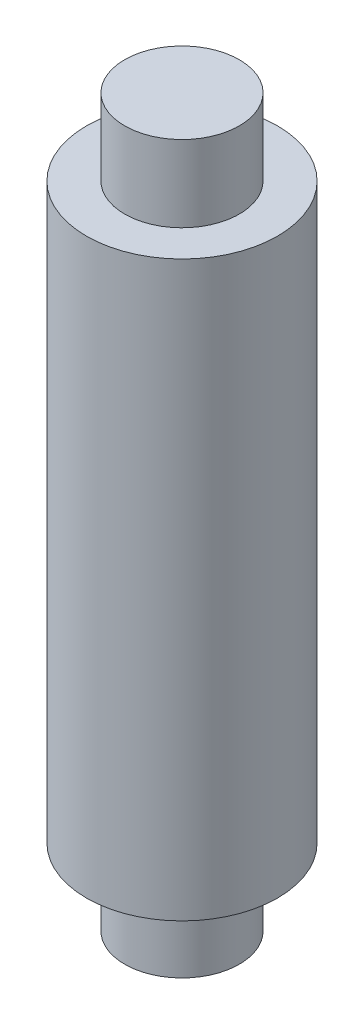
ISO-10303-21;
HEADER;
FILE_DESCRIPTION(('STEP AP214'),'2;1');
FILE_NAME('part.step','',(''),(''),'','','');
FILE_SCHEMA(('AUTOMOTIVE_DESIGN { 1 0 10303 214 1 1 1 1 }'));
ENDSEC;
DATA;
#1=APPLICATION_CONTEXT('core data for automotive mechanical design processes');
#2=APPLICATION_PROTOCOL_DEFINITION('international standard','automotive_design',2000,#1);
#3=PRODUCT_CONTEXT('',#1,'mechanical');
#4=PRODUCT('Part','Part','',(#3));
#5=PRODUCT_RELATED_PRODUCT_CATEGORY('part','',(#4));
#6=PRODUCT_DEFINITION_FORMATION('','',#4);
#7=PRODUCT_DEFINITION_CONTEXT('part definition',#1,'design');
#8=PRODUCT_DEFINITION('design','',#6,#7);
#9=PRODUCT_DEFINITION_SHAPE('','',#8);
#10=(LENGTH_UNIT() NAMED_UNIT(*) SI_UNIT(.MILLI.,.METRE.));
#11=(NAMED_UNIT(*) PLANE_ANGLE_UNIT() SI_UNIT($,.RADIAN.));
#12=(NAMED_UNIT(*) SI_UNIT($,.STERADIAN.) SOLID_ANGLE_UNIT());
#13=UNCERTAINTY_MEASURE_WITH_UNIT(LENGTH_MEASURE(1.E-05),#10,'distance_accuracy_value','');
#14=(GEOMETRIC_REPRESENTATION_CONTEXT(3) GLOBAL_UNCERTAINTY_ASSIGNED_CONTEXT((#13)) GLOBAL_UNIT_ASSIGNED_CONTEXT((#10,
#11,#12)) REPRESENTATION_CONTEXT('',''));
#15=CARTESIAN_POINT('',(0.,0.,0.));
#16=DIRECTION('',(0.,0.,1.));
#17=DIRECTION('',(1.,0.,0.));
#18=AXIS2_PLACEMENT_3D('',#15,#16,#17);
#19=CARTESIAN_POINT('',(-1.5,-11.6600942769009,0.));
#20=DIRECTION('',(0.,1.,0.));
#21=DIRECTION('',(-1.,0.,0.));
#22=AXIS2_PLACEMENT_3D('',#19,#20,#21);
#23=PLANE('',#22);
#24=CARTESIAN_POINT('',(0.,-11.6600942769009,0.));
#25=DIRECTION('',(0.,1.,0.));
#26=DIRECTION('',(-1.,0.,0.));
#27=AXIS2_PLACEMENT_3D('',#24,#25,#26);
#28=CIRCLE('',#27,1.5);
#29=CARTESIAN_POINT('',(-1.5,-11.6600942769009,0.));
#30=VERTEX_POINT('',#29);
#31=EDGE_CURVE('E58',#30,#30,#28,.T.);
#32=ORIENTED_EDGE('',*,*,#31,.T.);
#33=EDGE_LOOP('',(#32));
#34=FACE_BOUND('',#33,.T.);
#35=ADVANCED_FACE('F36',(#34),#23,.T.);
#36=CARTESIAN_POINT('',(0.,-30.6600942769009,0.));
#37=DIRECTION('',(0.,-1.,0.));
#38=DIRECTION('',(1.,0.,0.));
#39=AXIS2_PLACEMENT_3D('',#36,#37,#38);
#40=PLANE('',#39);
#41=CARTESIAN_POINT('',(0.,-30.6600942769009,0.));
#42=DIRECTION('',(0.,1.,0.));
#43=DIRECTION('',(-1.,0.,0.));
#44=AXIS2_PLACEMENT_3D('',#41,#42,#43);
#45=CIRCLE('',#44,1.5);
#46=CARTESIAN_POINT('',(-1.5,-30.6600942769009,0.));
#47=VERTEX_POINT('',#46);
#48=EDGE_CURVE('E10',#47,#47,#45,.T.);
#49=ORIENTED_EDGE('',*,*,#48,.F.);
#50=EDGE_LOOP('',(#49));
#51=FACE_BOUND('',#50,.T.);
#52=ADVANCED_FACE('F75',(#51),#40,.T.);
#53=CARTESIAN_POINT('',(0.,-11.6600942769009,0.));
#54=DIRECTION('',(0.,1.,0.));
#55=DIRECTION('',(-1.,0.,0.));
#56=AXIS2_PLACEMENT_3D('',#53,#54,#55);
#57=CYLINDRICAL_SURFACE('',#56,1.5);
#58=ORIENTED_EDGE('',*,*,#48,.T.);
#59=EDGE_LOOP('',(#58));
#60=FACE_BOUND('',#59,.T.);
#61=CARTESIAN_POINT('',(0.,-28.6600942769009,0.));
#62=DIRECTION('',(0.,1.,0.));
#63=DIRECTION('',(-1.,0.,0.));
#64=AXIS2_PLACEMENT_3D('',#61,#62,#63);
#65=CIRCLE('',#64,1.5);
#66=CARTESIAN_POINT('',(-1.5,-28.6600942769009,0.));
#67=VERTEX_POINT('',#66);
#68=EDGE_CURVE('E42',#67,#67,#65,.T.);
#69=ORIENTED_EDGE('',*,*,#68,.F.);
#70=EDGE_LOOP('',(#69));
#71=FACE_BOUND('',#70,.T.);
#72=ADVANCED_FACE('F79',(#60,#71),#57,.T.);
#73=CARTESIAN_POINT('',(-1.5,-28.6600942769009,0.));
#74=DIRECTION('',(0.,-1.,0.));
#75=DIRECTION('',(1.,0.,0.));
#76=AXIS2_PLACEMENT_3D('',#73,#74,#75);
#77=PLANE('',#76);
#78=ORIENTED_EDGE('',*,*,#68,.T.);
#79=EDGE_LOOP('',(#78));
#80=FACE_BOUND('',#79,.T.);
#81=CARTESIAN_POINT('',(0.,-28.6600942769009,0.));
#82=DIRECTION('',(0.,1.,0.));
#83=DIRECTION('',(-1.,0.,0.));
#84=AXIS2_PLACEMENT_3D('',#81,#82,#83);
#85=CIRCLE('',#84,2.5);
#86=CARTESIAN_POINT('',(-2.5,-28.6600942769009,0.));
#87=VERTEX_POINT('',#86);
#88=EDGE_CURVE('E46',#87,#87,#85,.T.);
#89=ORIENTED_EDGE('',*,*,#88,.F.);
#90=EDGE_LOOP('',(#89));
#91=FACE_BOUND('',#90,.T.);
#92=ADVANCED_FACE('F84',(#80,#91),#77,.T.);
#93=CARTESIAN_POINT('',(0.,-11.6600942769009,0.));
#94=DIRECTION('',(0.,1.,0.));
#95=DIRECTION('',(-1.,0.,0.));
#96=AXIS2_PLACEMENT_3D('',#93,#94,#95);
#97=CYLINDRICAL_SURFACE('',#96,2.5);
#98=ORIENTED_EDGE('',*,*,#88,.T.);
#99=EDGE_LOOP('',(#98));
#100=FACE_BOUND('',#99,.T.);
#101=CARTESIAN_POINT('',(0.,-13.6600942769009,0.));
#102=DIRECTION('',(0.,1.,0.));
#103=DIRECTION('',(-1.,0.,0.));
#104=AXIS2_PLACEMENT_3D('',#101,#102,#103);
#105=CIRCLE('',#104,2.5);
#106=CARTESIAN_POINT('',(-2.5,-13.6600942769009,0.));
#107=VERTEX_POINT('',#106);
#108=EDGE_CURVE('E50',#107,#107,#105,.T.);
#109=ORIENTED_EDGE('',*,*,#108,.F.);
#110=EDGE_LOOP('',(#109));
#111=FACE_BOUND('',#110,.T.);
#112=ADVANCED_FACE('F71',(#100,#111),#97,.T.);
#113=CARTESIAN_POINT('',(-2.5,-13.6600942769009,0.));
#114=DIRECTION('',(0.,1.,0.));
#115=DIRECTION('',(-1.,0.,0.));
#116=AXIS2_PLACEMENT_3D('',#113,#114,#115);
#117=PLANE('',#116);
#118=ORIENTED_EDGE('',*,*,#108,.T.);
#119=EDGE_LOOP('',(#118));
#120=FACE_BOUND('',#119,.T.);
#121=CARTESIAN_POINT('',(0.,-13.6600942769009,0.));
#122=DIRECTION('',(0.,1.,0.));
#123=DIRECTION('',(-1.,0.,0.));
#124=AXIS2_PLACEMENT_3D('',#121,#122,#123);
#125=CIRCLE('',#124,1.5);
#126=CARTESIAN_POINT('',(-1.5,-13.6600942769009,0.));
#127=VERTEX_POINT('',#126);
#128=EDGE_CURVE('E55',#127,#127,#125,.T.);
#129=ORIENTED_EDGE('',*,*,#128,.F.);
#130=EDGE_LOOP('',(#129));
#131=FACE_BOUND('',#130,.T.);
#132=ADVANCED_FACE('F65',(#120,#131),#117,.T.);
#133=CARTESIAN_POINT('',(0.,-11.6600942769009,0.));
#134=DIRECTION('',(0.,1.,0.));
#135=DIRECTION('',(-1.,0.,0.));
#136=AXIS2_PLACEMENT_3D('',#133,#134,#135);
#137=CYLINDRICAL_SURFACE('',#136,1.5);
#138=ORIENTED_EDGE('',*,*,#128,.T.);
#139=EDGE_LOOP('',(#138));
#140=FACE_BOUND('',#139,.T.);
#141=ORIENTED_EDGE('',*,*,#31,.F.);
#142=EDGE_LOOP('',(#141));
#143=FACE_BOUND('',#142,.T.);
#144=ADVANCED_FACE('F63',(#140,#143),#137,.T.);
#145=CLOSED_SHELL('',(#35,#52,#72,#92,#112,#132,#144));
#146=MANIFOLD_SOLID_BREP('B2',#145);
#147=ADVANCED_BREP_SHAPE_REPRESENTATION('',(#18,#146),#14);
#148=SHAPE_DEFINITION_REPRESENTATION(#9,#147);
ENDSEC;
END-ISO-10303-21;
